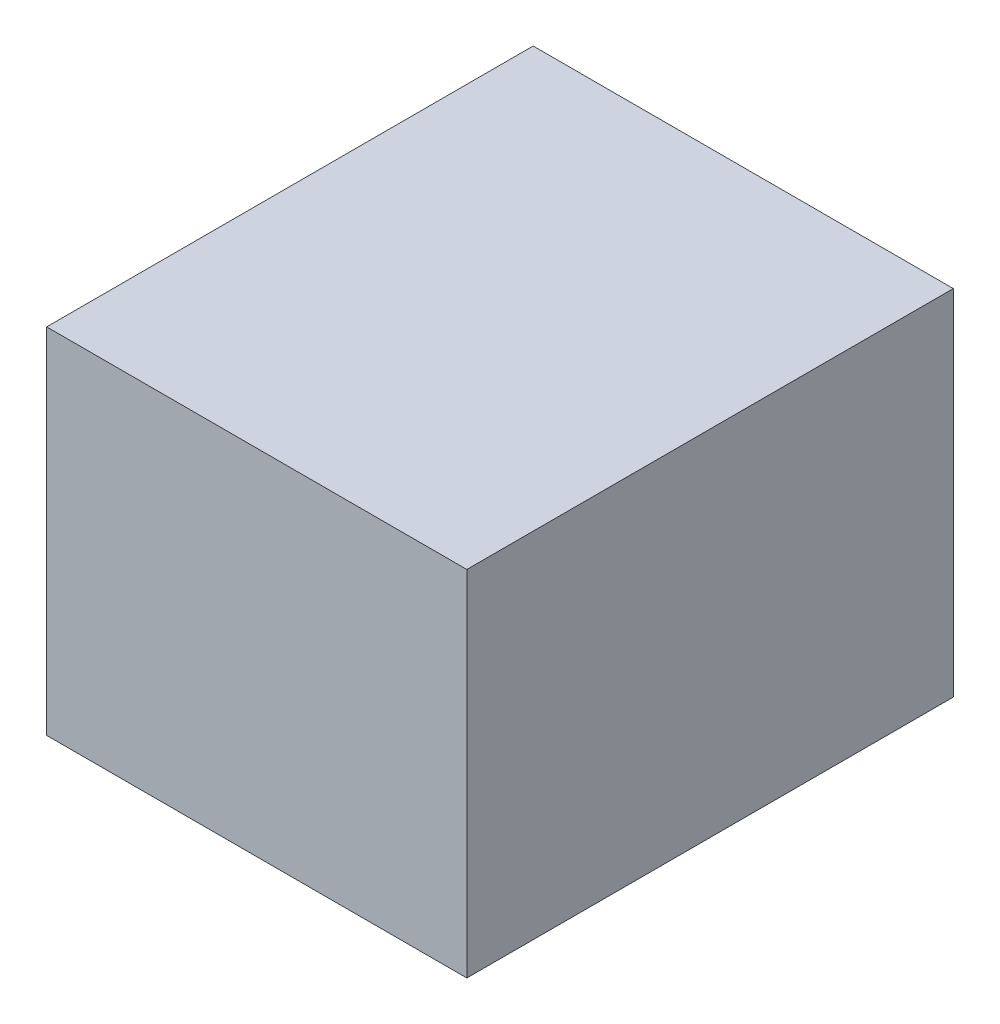
ISO-10303-21;
HEADER;
FILE_DESCRIPTION(('STEP AP214'),'2;1');
FILE_NAME('part.step','',(''),(''),'','','');
FILE_SCHEMA(('AUTOMOTIVE_DESIGN { 1 0 10303 214 1 1 1 1 }'));
ENDSEC;
DATA;
#1=APPLICATION_CONTEXT('core data for automotive mechanical design processes');
#2=APPLICATION_PROTOCOL_DEFINITION('international standard','automotive_design',2000,#1);
#3=PRODUCT_CONTEXT('',#1,'mechanical');
#4=PRODUCT('Part','Part','',(#3));
#5=PRODUCT_RELATED_PRODUCT_CATEGORY('part','',(#4));
#6=PRODUCT_DEFINITION_FORMATION('','',#4);
#7=PRODUCT_DEFINITION_CONTEXT('part definition',#1,'design');
#8=PRODUCT_DEFINITION('design','',#6,#7);
#9=PRODUCT_DEFINITION_SHAPE('','',#8);
#10=(LENGTH_UNIT() NAMED_UNIT(*) SI_UNIT(.MILLI.,.METRE.));
#11=(NAMED_UNIT(*) PLANE_ANGLE_UNIT() SI_UNIT($,.RADIAN.));
#12=(NAMED_UNIT(*) SI_UNIT($,.STERADIAN.) SOLID_ANGLE_UNIT());
#13=UNCERTAINTY_MEASURE_WITH_UNIT(LENGTH_MEASURE(1.E-05),#10,'distance_accuracy_value','');
#14=(GEOMETRIC_REPRESENTATION_CONTEXT(3) GLOBAL_UNCERTAINTY_ASSIGNED_CONTEXT((#13)) GLOBAL_UNIT_ASSIGNED_CONTEXT((#10,
#11,#12)) REPRESENTATION_CONTEXT('',''));
#15=CARTESIAN_POINT('',(0.,0.,0.));
#16=DIRECTION('',(0.,0.,1.));
#17=DIRECTION('',(1.,0.,0.));
#18=AXIS2_PLACEMENT_3D('',#15,#16,#17);
#19=CARTESIAN_POINT('',(19.,32.,22.));
#20=DIRECTION('',(-1.,0.,0.));
#21=DIRECTION('',(0.,0.,1.));
#22=AXIS2_PLACEMENT_3D('',#19,#20,#21);
#23=PLANE('',#22);
#24=DIRECTION('',(0.,0.,-1.));
#25=VECTOR('',#24,1.);
#26=CARTESIAN_POINT('',(19.,0.,22.));
#27=LINE('',#26,#25);
#28=CARTESIAN_POINT('',(19.,0.,22.));
#29=VERTEX_POINT('',#28);
#30=CARTESIAN_POINT('',(19.,0.,-22.));
#31=VERTEX_POINT('',#30);
#32=EDGE_CURVE('E102',#29,#31,#27,.T.);
#33=ORIENTED_EDGE('',*,*,#32,.T.);
#34=DIRECTION('',(0.,-1.,0.));
#35=VECTOR('',#34,1.);
#36=CARTESIAN_POINT('',(19.,32.,-22.));
#37=LINE('',#36,#35);
#38=CARTESIAN_POINT('',(19.,32.,-22.));
#39=VERTEX_POINT('',#38);
#40=EDGE_CURVE('E11',#39,#31,#37,.T.);
#41=ORIENTED_EDGE('',*,*,#40,.F.);
#42=DIRECTION('',(0.,0.,-1.));
#43=VECTOR('',#42,1.);
#44=CARTESIAN_POINT('',(19.,32.,22.));
#45=LINE('',#44,#43);
#46=CARTESIAN_POINT('',(19.,32.,22.));
#47=VERTEX_POINT('',#46);
#48=EDGE_CURVE('E90',#47,#39,#45,.T.);
#49=ORIENTED_EDGE('',*,*,#48,.F.);
#50=DIRECTION('',(0.,-1.,0.));
#51=VECTOR('',#50,1.);
#52=CARTESIAN_POINT('',(19.,32.,22.));
#53=LINE('',#52,#51);
#54=EDGE_CURVE('E98',#47,#29,#53,.T.);
#55=ORIENTED_EDGE('',*,*,#54,.T.);
#56=EDGE_LOOP('',(#33,#41,#49,#55));
#57=FACE_BOUND('',#56,.T.);
#58=ADVANCED_FACE('F39',(#57),#23,.F.);
#59=CARTESIAN_POINT('',(-19.,32.,-22.));
#60=DIRECTION('',(0.,0.,1.));
#61=DIRECTION('',(1.,0.,0.));
#62=AXIS2_PLACEMENT_3D('',#59,#60,#61);
#63=PLANE('',#62);
#64=DIRECTION('',(-1.,0.,0.));
#65=VECTOR('',#64,1.);
#66=CARTESIAN_POINT('',(-19.,0.,-22.));
#67=LINE('',#66,#65);
#68=CARTESIAN_POINT('',(-19.,0.,-22.));
#69=VERTEX_POINT('',#68);
#70=EDGE_CURVE('E94',#31,#69,#67,.T.);
#71=ORIENTED_EDGE('',*,*,#70,.T.);
#72=DIRECTION('',(0.,-1.,0.));
#73=VECTOR('',#72,1.);
#74=CARTESIAN_POINT('',(-19.,32.,-22.));
#75=LINE('',#74,#73);
#76=CARTESIAN_POINT('',(-19.,32.,-22.));
#77=VERTEX_POINT('',#76);
#78=EDGE_CURVE('E47',#77,#69,#75,.T.);
#79=ORIENTED_EDGE('',*,*,#78,.F.);
#80=DIRECTION('',(-1.,0.,0.));
#81=VECTOR('',#80,1.);
#82=CARTESIAN_POINT('',(-19.,32.,-22.));
#83=LINE('',#82,#81);
#84=EDGE_CURVE('E85',#39,#77,#83,.T.);
#85=ORIENTED_EDGE('',*,*,#84,.F.);
#86=ORIENTED_EDGE('',*,*,#40,.T.);
#87=EDGE_LOOP('',(#71,#79,#85,#86));
#88=FACE_BOUND('',#87,.T.);
#89=ADVANCED_FACE('F93',(#88),#63,.F.);
#90=CARTESIAN_POINT('',(-19.,32.,22.));
#91=DIRECTION('',(1.,0.,0.));
#92=DIRECTION('',(0.,0.,-1.));
#93=AXIS2_PLACEMENT_3D('',#90,#91,#92);
#94=PLANE('',#93);
#95=DIRECTION('',(0.,0.,1.));
#96=VECTOR('',#95,1.);
#97=CARTESIAN_POINT('',(-19.,0.,22.));
#98=LINE('',#97,#96);
#99=CARTESIAN_POINT('',(-19.,0.,22.));
#100=VERTEX_POINT('',#99);
#101=EDGE_CURVE('E72',#69,#100,#98,.T.);
#102=ORIENTED_EDGE('',*,*,#101,.T.);
#103=DIRECTION('',(0.,-1.,0.));
#104=VECTOR('',#103,1.);
#105=CARTESIAN_POINT('',(-19.,32.,22.));
#106=LINE('',#105,#104);
#107=CARTESIAN_POINT('',(-19.,32.,22.));
#108=VERTEX_POINT('',#107);
#109=EDGE_CURVE('E95',#108,#100,#106,.T.);
#110=ORIENTED_EDGE('',*,*,#109,.F.);
#111=DIRECTION('',(0.,0.,1.));
#112=VECTOR('',#111,1.);
#113=CARTESIAN_POINT('',(-19.,32.,22.));
#114=LINE('',#113,#112);
#115=EDGE_CURVE('E88',#77,#108,#114,.T.);
#116=ORIENTED_EDGE('',*,*,#115,.F.);
#117=ORIENTED_EDGE('',*,*,#78,.T.);
#118=EDGE_LOOP('',(#102,#110,#116,#117));
#119=FACE_BOUND('',#118,.T.);
#120=ADVANCED_FACE('F96',(#119),#94,.F.);
#121=CARTESIAN_POINT('',(-19.,32.,22.));
#122=DIRECTION('',(0.,0.,-1.));
#123=DIRECTION('',(-1.,0.,0.));
#124=AXIS2_PLACEMENT_3D('',#121,#122,#123);
#125=PLANE('',#124);
#126=DIRECTION('',(1.,0.,0.));
#127=VECTOR('',#126,1.);
#128=CARTESIAN_POINT('',(-19.,0.,22.));
#129=LINE('',#128,#127);
#130=EDGE_CURVE('E78',#100,#29,#129,.T.);
#131=ORIENTED_EDGE('',*,*,#130,.T.);
#132=ORIENTED_EDGE('',*,*,#54,.F.);
#133=DIRECTION('',(1.,0.,0.));
#134=VECTOR('',#133,1.);
#135=CARTESIAN_POINT('',(-19.,32.,22.));
#136=LINE('',#135,#134);
#137=EDGE_CURVE('E55',#108,#47,#136,.T.);
#138=ORIENTED_EDGE('',*,*,#137,.F.);
#139=ORIENTED_EDGE('',*,*,#109,.T.);
#140=EDGE_LOOP('',(#131,#132,#138,#139));
#141=FACE_BOUND('',#140,.T.);
#142=ADVANCED_FACE('F109',(#141),#125,.F.);
#143=CARTESIAN_POINT('',(0.,32.,0.));
#144=DIRECTION('',(0.,-1.,0.));
#145=DIRECTION('',(0.,0.,-1.));
#146=AXIS2_PLACEMENT_3D('',#143,#144,#145);
#147=PLANE('',#146);
#148=ORIENTED_EDGE('',*,*,#48,.T.);
#149=ORIENTED_EDGE('',*,*,#84,.T.);
#150=ORIENTED_EDGE('',*,*,#115,.T.);
#151=ORIENTED_EDGE('',*,*,#137,.T.);
#152=EDGE_LOOP('',(#148,#149,#150,#151));
#153=FACE_BOUND('',#152,.T.);
#154=ADVANCED_FACE('F86',(#153),#147,.F.);
#155=CARTESIAN_POINT('',(0.,0.,0.));
#156=DIRECTION('',(0.,-1.,0.));
#157=DIRECTION('',(0.,0.,-1.));
#158=AXIS2_PLACEMENT_3D('',#155,#156,#157);
#159=PLANE('',#158);
#160=ORIENTED_EDGE('',*,*,#32,.F.);
#161=ORIENTED_EDGE('',*,*,#130,.F.);
#162=ORIENTED_EDGE('',*,*,#101,.F.);
#163=ORIENTED_EDGE('',*,*,#70,.F.);
#164=EDGE_LOOP('',(#160,#161,#162,#163));
#165=FACE_BOUND('',#164,.T.);
#166=ADVANCED_FACE('F112',(#165),#159,.T.);
#167=CLOSED_SHELL('',(#58,#89,#120,#142,#154,#166));
#168=MANIFOLD_SOLID_BREP('B2',#167);
#169=ADVANCED_BREP_SHAPE_REPRESENTATION('',(#18,#168),#14);
#170=SHAPE_DEFINITION_REPRESENTATION(#9,#169);
ENDSEC;
END-ISO-10303-21;
